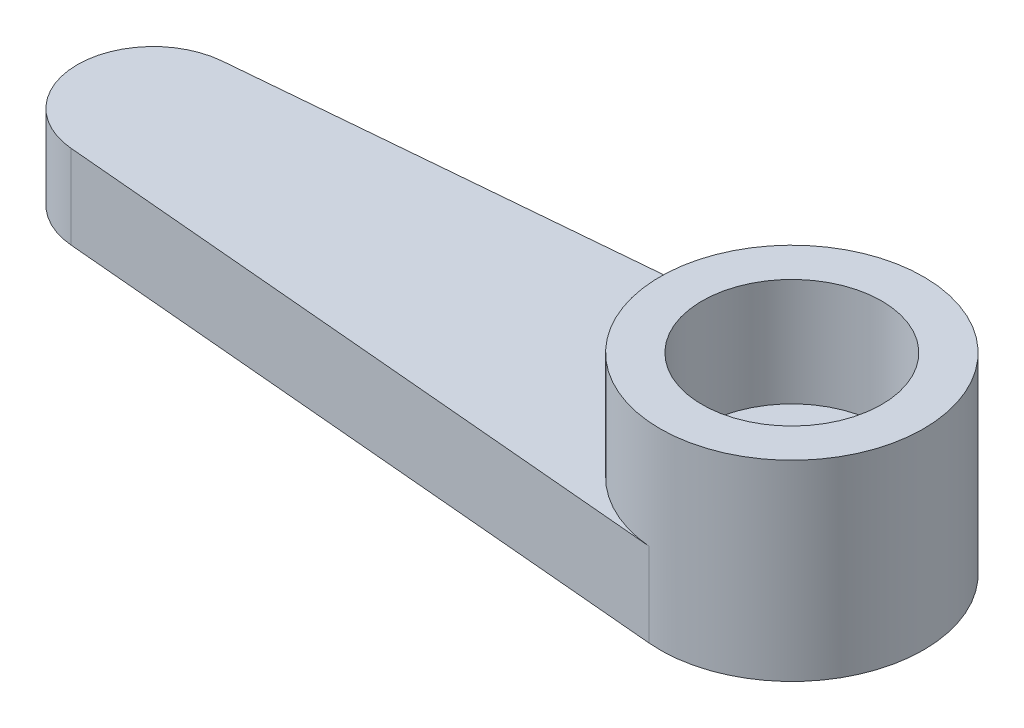
ISO-10303-21;
HEADER;
FILE_DESCRIPTION(('STEP AP214'),'2;1');
FILE_NAME('part.step','',(''),(''),'','','');
FILE_SCHEMA(('AUTOMOTIVE_DESIGN { 1 0 10303 214 1 1 1 1 }'));
ENDSEC;
DATA;
#1=APPLICATION_CONTEXT('core data for automotive mechanical design processes');
#2=APPLICATION_PROTOCOL_DEFINITION('international standard','automotive_design',2000,#1);
#3=PRODUCT_CONTEXT('',#1,'mechanical');
#4=PRODUCT('Part','Part','',(#3));
#5=PRODUCT_RELATED_PRODUCT_CATEGORY('part','',(#4));
#6=PRODUCT_DEFINITION_FORMATION('','',#4);
#7=PRODUCT_DEFINITION_CONTEXT('part definition',#1,'design');
#8=PRODUCT_DEFINITION('design','',#6,#7);
#9=PRODUCT_DEFINITION_SHAPE('','',#8);
#10=(LENGTH_UNIT() NAMED_UNIT(*) SI_UNIT(.MILLI.,.METRE.));
#11=(NAMED_UNIT(*) PLANE_ANGLE_UNIT() SI_UNIT($,.RADIAN.));
#12=(NAMED_UNIT(*) SI_UNIT($,.STERADIAN.) SOLID_ANGLE_UNIT());
#13=UNCERTAINTY_MEASURE_WITH_UNIT(LENGTH_MEASURE(1.E-05),#10,'distance_accuracy_value','');
#14=(GEOMETRIC_REPRESENTATION_CONTEXT(3) GLOBAL_UNCERTAINTY_ASSIGNED_CONTEXT((#13)) GLOBAL_UNIT_ASSIGNED_CONTEXT((#10,
#11,#12)) REPRESENTATION_CONTEXT('',''));
#15=CARTESIAN_POINT('',(0.,0.,0.));
#16=DIRECTION('',(0.,0.,1.));
#17=DIRECTION('',(1.,0.,0.));
#18=AXIS2_PLACEMENT_3D('',#15,#16,#17);
#19=CARTESIAN_POINT('',(-16.,2.1,0.));
#20=DIRECTION('',(0.,-1.,0.));
#21=DIRECTION('',(0.,0.,-1.));
#22=AXIS2_PLACEMENT_3D('',#19,#20,#21);
#23=CYLINDRICAL_SURFACE('',#22,1.9);
#24=CARTESIAN_POINT('',(-16.,0.,0.));
#25=DIRECTION('',(0.,1.,0.));
#26=DIRECTION('',(0.,0.,1.));
#27=AXIS2_PLACEMENT_3D('',#24,#25,#26);
#28=CIRCLE('',#27,1.9);
#29=CARTESIAN_POINT('',(-16.16625,0.,-1.89271258713519));
#30=VERTEX_POINT('',#29);
#31=CARTESIAN_POINT('',(-16.16625,0.,1.8927125871352));
#32=VERTEX_POINT('',#31);
#33=EDGE_CURVE('E97',#30,#32,#28,.T.);
#34=ORIENTED_EDGE('',*,*,#33,.T.);
#35=DIRECTION('',(0.,-1.,0.));
#36=VECTOR('',#35,1.);
#37=CARTESIAN_POINT('',(-16.16625,2.1,1.8927125871352));
#38=LINE('',#37,#36);
#39=CARTESIAN_POINT('',(-16.16625,2.1,1.8927125871352));
#40=VERTEX_POINT('',#39);
#41=EDGE_CURVE('E11',#40,#32,#38,.T.);
#42=ORIENTED_EDGE('',*,*,#41,.F.);
#43=CARTESIAN_POINT('',(-16.,2.1,0.));
#44=DIRECTION('',(0.,1.,0.));
#45=DIRECTION('',(0.,0.,1.));
#46=AXIS2_PLACEMENT_3D('',#43,#44,#45);
#47=CIRCLE('',#46,1.9);
#48=CARTESIAN_POINT('',(-16.16625,2.1,-1.89271258713519));
#49=VERTEX_POINT('',#48);
#50=EDGE_CURVE('E104',#49,#40,#47,.T.);
#51=ORIENTED_EDGE('',*,*,#50,.F.);
#52=DIRECTION('',(0.,-1.,0.));
#53=VECTOR('',#52,1.);
#54=CARTESIAN_POINT('',(-16.16625,2.1,-1.89271258713519));
#55=LINE('',#54,#53);
#56=EDGE_CURVE('E84',#49,#30,#55,.T.);
#57=ORIENTED_EDGE('',*,*,#56,.T.);
#58=EDGE_LOOP('',(#34,#42,#51,#57));
#59=FACE_BOUND('',#58,.T.);
#60=ADVANCED_FACE('F34',(#59),#23,.T.);
#61=CARTESIAN_POINT('',(-16.16625,2.1,1.8927125871352));
#62=DIRECTION('',(0.0874999999999998,0.,-0.996164519544839));
#63=DIRECTION('',(-0.996164519544839,0.,-0.0874999999999998));
#64=AXIS2_PLACEMENT_3D('',#61,#62,#63);
#65=PLANE('',#64);
#66=DIRECTION('',(0.996164519544839,0.,0.0874999999999998));
#67=VECTOR('',#66,1.);
#68=CARTESIAN_POINT('',(-16.16625,0.,1.8927125871352));
#69=LINE('',#68,#67);
#70=CARTESIAN_POINT('',(-0.288750000000002,0.,3.28734291449797));
#71=VERTEX_POINT('',#70);
#72=EDGE_CURVE('E109',#32,#71,#69,.T.);
#73=ORIENTED_EDGE('',*,*,#72,.T.);
#74=DIRECTION('',(0.,-1.,0.));
#75=VECTOR('',#74,1.);
#76=CARTESIAN_POINT('',(-0.288750000000002,2.1,3.28734291449797));
#77=LINE('',#76,#75);
#78=CARTESIAN_POINT('',(-0.288750000000002,2.1,3.28734291449797));
#79=VERTEX_POINT('',#78);
#80=EDGE_CURVE('E43',#79,#71,#77,.T.);
#81=ORIENTED_EDGE('',*,*,#80,.F.);
#82=DIRECTION('',(0.996164519544839,0.,0.0874999999999998));
#83=VECTOR('',#82,1.);
#84=CARTESIAN_POINT('',(-16.16625,2.1,1.8927125871352));
#85=LINE('',#84,#83);
#86=EDGE_CURVE('E80',#40,#79,#85,.T.);
#87=ORIENTED_EDGE('',*,*,#86,.F.);
#88=ORIENTED_EDGE('',*,*,#41,.T.);
#89=EDGE_LOOP('',(#73,#81,#87,#88));
#90=FACE_BOUND('',#89,.T.);
#91=ADVANCED_FACE('F119',(#90),#65,.F.);
#92=CARTESIAN_POINT('',(0.,2.1,0.));
#93=DIRECTION('',(0.,-1.,0.));
#94=DIRECTION('',(0.,0.,-1.));
#95=AXIS2_PLACEMENT_3D('',#92,#93,#94);
#96=CYLINDRICAL_SURFACE('',#95,3.3);
#97=CARTESIAN_POINT('',(0.,0.,0.));
#98=DIRECTION('',(0.,1.,0.));
#99=DIRECTION('',(0.,0.,1.));
#100=AXIS2_PLACEMENT_3D('',#97,#98,#99);
#101=CIRCLE('',#100,3.3);
#102=CARTESIAN_POINT('',(-0.288750000000001,0.,-3.28734291449797));
#103=VERTEX_POINT('',#102);
#104=EDGE_CURVE('E70',#71,#103,#101,.T.);
#105=ORIENTED_EDGE('',*,*,#104,.T.);
#106=DIRECTION('',(0.,-1.,0.));
#107=VECTOR('',#106,1.);
#108=CARTESIAN_POINT('',(-0.288750000000001,2.1,-3.28734291449797));
#109=LINE('',#108,#107);
#110=CARTESIAN_POINT('',(-0.288750000000001,2.1,-3.28734291449797));
#111=VERTEX_POINT('',#110);
#112=EDGE_CURVE('E83',#111,#103,#109,.T.);
#113=ORIENTED_EDGE('',*,*,#112,.F.);
#114=CARTESIAN_POINT('',(0.,2.1,0.));
#115=DIRECTION('',(0.,1.,0.));
#116=DIRECTION('',(0.,0.,1.));
#117=AXIS2_PLACEMENT_3D('',#114,#115,#116);
#118=CIRCLE('',#117,3.3);
#119=EDGE_CURVE('E90',#111,#79,#118,.T.);
#120=ORIENTED_EDGE('',*,*,#119,.T.);
#121=ORIENTED_EDGE('',*,*,#80,.T.);
#122=EDGE_LOOP('',(#105,#113,#120,#121));
#123=FACE_BOUND('',#122,.T.);
#124=CARTESIAN_POINT('',(0.,4.8,0.));
#125=DIRECTION('',(0.,1.,0.));
#126=DIRECTION('',(0.,0.,1.));
#127=AXIS2_PLACEMENT_3D('',#124,#125,#126);
#128=CIRCLE('',#127,3.3);
#129=CARTESIAN_POINT('',(0.,4.8,3.3));
#130=VERTEX_POINT('',#129);
#131=EDGE_CURVE('E93',#130,#130,#128,.T.);
#132=ORIENTED_EDGE('',*,*,#131,.F.);
#133=EDGE_LOOP('',(#132));
#134=FACE_BOUND('',#133,.T.);
#135=ADVANCED_FACE('F88',(#123,#134),#96,.T.);
#136=CARTESIAN_POINT('',(-16.16625,2.1,-1.89271258713519));
#137=DIRECTION('',(0.0875000000000001,0.,0.996164519544839));
#138=DIRECTION('',(0.996164519544839,0.,-0.0875000000000001));
#139=AXIS2_PLACEMENT_3D('',#136,#137,#138);
#140=PLANE('',#139);
#141=DIRECTION('',(-0.996164519544839,0.,0.0875000000000001));
#142=VECTOR('',#141,1.);
#143=CARTESIAN_POINT('',(-16.16625,0.,-1.89271258713519));
#144=LINE('',#143,#142);
#145=EDGE_CURVE('E75',#103,#30,#144,.T.);
#146=ORIENTED_EDGE('',*,*,#145,.T.);
#147=ORIENTED_EDGE('',*,*,#56,.F.);
#148=DIRECTION('',(-0.996164519544839,0.,0.0875000000000001));
#149=VECTOR('',#148,1.);
#150=CARTESIAN_POINT('',(-16.16625,2.1,-1.89271258713519));
#151=LINE('',#150,#149);
#152=EDGE_CURVE('E51',#111,#49,#151,.T.);
#153=ORIENTED_EDGE('',*,*,#152,.F.);
#154=ORIENTED_EDGE('',*,*,#112,.T.);
#155=EDGE_LOOP('',(#146,#147,#153,#154));
#156=FACE_BOUND('',#155,.T.);
#157=ADVANCED_FACE('F82',(#156),#140,.F.);
#158=CARTESIAN_POINT('',(-16.,2.1,0.));
#159=DIRECTION('',(0.,1.,0.));
#160=DIRECTION('',(0.,0.,1.));
#161=AXIS2_PLACEMENT_3D('',#158,#159,#160);
#162=PLANE('',#161);
#163=ORIENTED_EDGE('',*,*,#119,.F.);
#164=ORIENTED_EDGE('',*,*,#152,.T.);
#165=ORIENTED_EDGE('',*,*,#50,.T.);
#166=ORIENTED_EDGE('',*,*,#86,.T.);
#167=EDGE_LOOP('',(#163,#164,#165,#166));
#168=FACE_BOUND('',#167,.T.);
#169=ADVANCED_FACE('F92',(#168),#162,.T.);
#170=CARTESIAN_POINT('',(-16.,0.,0.));
#171=DIRECTION('',(0.,1.,0.));
#172=DIRECTION('',(0.,0.,1.));
#173=AXIS2_PLACEMENT_3D('',#170,#171,#172);
#174=PLANE('',#173);
#175=CARTESIAN_POINT('',(0.,0.,0.));
#176=DIRECTION('',(0.,1.,0.));
#177=DIRECTION('',(0.,0.,1.));
#178=AXIS2_PLACEMENT_3D('',#175,#176,#177);
#179=CIRCLE('',#178,1.2);
#180=CARTESIAN_POINT('',(0.,0.,1.2));
#181=VERTEX_POINT('',#180);
#182=EDGE_CURVE('E37',#181,#181,#179,.T.);
#183=ORIENTED_EDGE('',*,*,#182,.T.);
#184=EDGE_LOOP('',(#183));
#185=FACE_BOUND('',#184,.T.);
#186=ORIENTED_EDGE('',*,*,#33,.F.);
#187=ORIENTED_EDGE('',*,*,#145,.F.);
#188=ORIENTED_EDGE('',*,*,#104,.F.);
#189=ORIENTED_EDGE('',*,*,#72,.F.);
#190=EDGE_LOOP('',(#186,#187,#188,#189));
#191=FACE_BOUND('',#190,.T.);
#192=ADVANCED_FACE('F116',(#185,#191),#174,.F.);
#193=CARTESIAN_POINT('',(0.,4.8,0.));
#194=DIRECTION('',(0.,1.,0.));
#195=DIRECTION('',(0.,0.,1.));
#196=AXIS2_PLACEMENT_3D('',#193,#194,#195);
#197=PLANE('',#196);
#198=ORIENTED_EDGE('',*,*,#131,.T.);
#199=EDGE_LOOP('',(#198));
#200=FACE_BOUND('',#199,.T.);
#201=CARTESIAN_POINT('',(0.,4.8,0.));
#202=DIRECTION('',(0.,1.,0.));
#203=DIRECTION('',(0.,0.,1.));
#204=AXIS2_PLACEMENT_3D('',#201,#202,#203);
#205=CIRCLE('',#204,2.25);
#206=CARTESIAN_POINT('',(0.,4.8,-2.25));
#207=VERTEX_POINT('',#206);
#208=EDGE_CURVE('E94',#207,#207,#205,.T.);
#209=ORIENTED_EDGE('',*,*,#208,.F.);
#210=EDGE_LOOP('',(#209));
#211=FACE_BOUND('',#210,.T.);
#212=ADVANCED_FACE('F131',(#200,#211),#197,.T.);
#213=CARTESIAN_POINT('',(0.,4.8,0.));
#214=DIRECTION('',(0.,-1.,0.));
#215=DIRECTION('',(0.,0.,-1.));
#216=AXIS2_PLACEMENT_3D('',#213,#214,#215);
#217=CYLINDRICAL_SURFACE('',#216,2.25);
#218=CARTESIAN_POINT('',(0.,2.1,0.));
#219=DIRECTION('',(0.,1.,0.));
#220=DIRECTION('',(0.,0.,1.));
#221=AXIS2_PLACEMENT_3D('',#218,#219,#220);
#222=CIRCLE('',#221,2.25);
#223=CARTESIAN_POINT('',(0.,2.1,-2.25));
#224=VERTEX_POINT('',#223);
#225=EDGE_CURVE('E100',#224,#224,#222,.T.);
#226=CARTESIAN_POINT('',(0.,4.8,-2.25));
#227=CARTESIAN_POINT('',(0.,4.771875,-2.25));
#228=CARTESIAN_POINT('',(0.,4.74375,-2.25));
#229=CARTESIAN_POINT('',(0.,4.6875,-2.25));
#230=CARTESIAN_POINT('',(0.,4.659375,-2.25));
#231=CARTESIAN_POINT('',(0.,4.603125,-2.25));
#232=CARTESIAN_POINT('',(0.,4.575,-2.25));
#233=CARTESIAN_POINT('',(0.,4.51875,-2.25));
#234=CARTESIAN_POINT('',(0.,4.490625,-2.25));
#235=CARTESIAN_POINT('',(0.,4.434375,-2.25));
#236=CARTESIAN_POINT('',(0.,4.40625,-2.25));
#237=CARTESIAN_POINT('',(0.,4.35,-2.25));
#238=CARTESIAN_POINT('',(0.,4.321875,-2.25));
#239=CARTESIAN_POINT('',(0.,4.265625,-2.25));
#240=CARTESIAN_POINT('',(0.,4.2375,-2.25));
#241=CARTESIAN_POINT('',(0.,4.18125,-2.25));
#242=CARTESIAN_POINT('',(0.,4.153125,-2.25));
#243=CARTESIAN_POINT('',(0.,4.096875,-2.25));
#244=CARTESIAN_POINT('',(0.,4.06875,-2.25));
#245=CARTESIAN_POINT('',(0.,4.0125,-2.25));
#246=CARTESIAN_POINT('',(0.,3.984375,-2.25));
#247=CARTESIAN_POINT('',(0.,3.928125,-2.25));
#248=CARTESIAN_POINT('',(0.,3.9,-2.25));
#249=CARTESIAN_POINT('',(0.,3.84375,-2.25));
#250=CARTESIAN_POINT('',(0.,3.815625,-2.25));
#251=CARTESIAN_POINT('',(0.,3.759375,-2.25));
#252=CARTESIAN_POINT('',(0.,3.73125,-2.25));
#253=CARTESIAN_POINT('',(0.,3.675,-2.25));
#254=CARTESIAN_POINT('',(0.,3.646875,-2.25));
#255=CARTESIAN_POINT('',(0.,3.590625,-2.25));
#256=CARTESIAN_POINT('',(0.,3.5625,-2.25));
#257=CARTESIAN_POINT('',(0.,3.50625,-2.25));
#258=CARTESIAN_POINT('',(0.,3.478125,-2.25));
#259=CARTESIAN_POINT('',(0.,3.421875,-2.25));
#260=CARTESIAN_POINT('',(0.,3.39375,-2.25));
#261=CARTESIAN_POINT('',(0.,3.3375,-2.25));
#262=CARTESIAN_POINT('',(0.,3.309375,-2.25));
#263=CARTESIAN_POINT('',(0.,3.253125,-2.25));
#264=CARTESIAN_POINT('',(0.,3.225,-2.25));
#265=CARTESIAN_POINT('',(0.,3.16875,-2.25));
#266=CARTESIAN_POINT('',(0.,3.140625,-2.25));
#267=CARTESIAN_POINT('',(0.,3.084375,-2.25));
#268=CARTESIAN_POINT('',(0.,3.05625,-2.25));
#269=CARTESIAN_POINT('',(0.,3.,-2.25));
#270=CARTESIAN_POINT('',(0.,2.971875,-2.25));
#271=CARTESIAN_POINT('',(0.,2.915625,-2.25));
#272=CARTESIAN_POINT('',(0.,2.8875,-2.25));
#273=CARTESIAN_POINT('',(0.,2.83125,-2.25));
#274=CARTESIAN_POINT('',(0.,2.803125,-2.25));
#275=CARTESIAN_POINT('',(0.,2.746875,-2.25));
#276=CARTESIAN_POINT('',(0.,2.71875,-2.25));
#277=CARTESIAN_POINT('',(0.,2.6625,-2.25));
#278=CARTESIAN_POINT('',(0.,2.634375,-2.25));
#279=CARTESIAN_POINT('',(0.,2.578125,-2.25));
#280=CARTESIAN_POINT('',(0.,2.55,-2.25));
#281=CARTESIAN_POINT('',(0.,2.49375,-2.25));
#282=CARTESIAN_POINT('',(0.,2.465625,-2.25));
#283=CARTESIAN_POINT('',(0.,2.409375,-2.25));
#284=CARTESIAN_POINT('',(0.,2.38125,-2.25));
#285=CARTESIAN_POINT('',(0.,2.325,-2.25));
#286=CARTESIAN_POINT('',(0.,2.296875,-2.25));
#287=CARTESIAN_POINT('',(0.,2.240625,-2.25));
#288=CARTESIAN_POINT('',(0.,2.2125,-2.25));
#289=CARTESIAN_POINT('',(0.,2.15625,-2.25));
#290=CARTESIAN_POINT('',(0.,2.128125,-2.25));
#291=CARTESIAN_POINT('',(0.,2.1,-2.25));
#292=B_SPLINE_CURVE_WITH_KNOTS('',3,(#226,#227,#228,#229,#230,#231,#232,#233,#234,#235,#236,
#237,#238,#239,#240,#241,#242,#243,#244,#245,#246,#247,#248,#249,#250,#251,#252,#253,#254,#255,
#256,#257,#258,#259,#260,#261,#262,#263,#264,#265,#266,#267,#268,#269,#270,#271,#272,#273,#274,
#275,#276,#277,#278,#279,#280,#281,#282,#283,#284,#285,#286,#287,#288,#289,#290,#291),
.UNSPECIFIED.,.F.,.F.,(4,2,2,2,2,2,2,2,2,2,2,2,2,2,2,2,2,2,2,2,2,2,2,2,2,2,2,2,2,2,2,2,4),(0.,
0.0843749999999994,0.16875,0.253125,0.337499999999999,0.421875,0.50625,0.590625,
0.674999999999999,0.759375,0.84375,0.928125,1.0125,1.096875,1.18125,1.265625,1.35,1.434375,
1.51875,1.603125,1.6875,1.771875,1.85625,1.940625,2.025,2.109375,2.19375,2.278125,2.3625,
2.446875,2.53125,2.615625,2.7),.UNSPECIFIED.);
#293=EDGE_CURVE('BSEAM138',#207,#224,#292,.T.);
#294=ORIENTED_EDGE('',*,*,#208,.T.);
#295=ORIENTED_EDGE('',*,*,#225,.F.);
#296=ORIENTED_EDGE('',*,*,#293,.T.);
#297=ORIENTED_EDGE('',*,*,#293,.F.);
#298=EDGE_LOOP('',(#294,#296,#295,#297));
#299=FACE_BOUND('',#298,.T.);
#300=ADVANCED_FACE('F138',(#299),#217,.F.);
#301=CARTESIAN_POINT('',(0.,2.1,0.));
#302=DIRECTION('',(0.,1.,0.));
#303=DIRECTION('',(0.,0.,1.));
#304=AXIS2_PLACEMENT_3D('',#301,#302,#303);
#305=CIRCLE('',#304,1.2);
#306=CARTESIAN_POINT('',(0.,2.1,1.2));
#307=VERTEX_POINT('',#306);
#308=EDGE_CURVE('E153',#307,#307,#305,.T.);
#309=ORIENTED_EDGE('',*,*,#308,.F.);
#310=EDGE_LOOP('',(#309));
#311=FACE_BOUND('',#310,.T.);
#312=ORIENTED_EDGE('',*,*,#225,.T.);
#313=EDGE_LOOP('',(#312));
#314=FACE_BOUND('',#313,.T.);
#315=ADVANCED_FACE('F135',(#311,#314),#162,.T.);
#316=CARTESIAN_POINT('',(0.,-0.6,0.));
#317=DIRECTION('',(0.,1.,0.));
#318=DIRECTION('',(0.,0.,1.));
#319=AXIS2_PLACEMENT_3D('',#316,#317,#318);
#320=CYLINDRICAL_SURFACE('',#319,1.2);
#321=CARTESIAN_POINT('',(0.,2.1,1.2));
#322=CARTESIAN_POINT('',(0.,2.078125,1.2));
#323=CARTESIAN_POINT('',(0.,2.05625,1.2));
#324=CARTESIAN_POINT('',(0.,2.0125,1.2));
#325=CARTESIAN_POINT('',(0.,1.990625,1.2));
#326=CARTESIAN_POINT('',(0.,1.946875,1.2));
#327=CARTESIAN_POINT('',(0.,1.925,1.2));
#328=CARTESIAN_POINT('',(0.,1.88125,1.2));
#329=CARTESIAN_POINT('',(0.,1.859375,1.2));
#330=CARTESIAN_POINT('',(0.,1.815625,1.2));
#331=CARTESIAN_POINT('',(0.,1.79375,1.2));
#332=CARTESIAN_POINT('',(0.,1.75,1.2));
#333=CARTESIAN_POINT('',(0.,1.728125,1.2));
#334=CARTESIAN_POINT('',(0.,1.684375,1.2));
#335=CARTESIAN_POINT('',(0.,1.6625,1.2));
#336=CARTESIAN_POINT('',(0.,1.61875,1.2));
#337=CARTESIAN_POINT('',(0.,1.596875,1.2));
#338=CARTESIAN_POINT('',(0.,1.553125,1.2));
#339=CARTESIAN_POINT('',(0.,1.53125,1.2));
#340=CARTESIAN_POINT('',(0.,1.4875,1.2));
#341=CARTESIAN_POINT('',(0.,1.465625,1.2));
#342=CARTESIAN_POINT('',(0.,1.421875,1.2));
#343=CARTESIAN_POINT('',(0.,1.4,1.2));
#344=CARTESIAN_POINT('',(0.,1.35625,1.2));
#345=CARTESIAN_POINT('',(0.,1.334375,1.2));
#346=CARTESIAN_POINT('',(0.,1.290625,1.2));
#347=CARTESIAN_POINT('',(0.,1.26875,1.2));
#348=CARTESIAN_POINT('',(0.,1.225,1.2));
#349=CARTESIAN_POINT('',(0.,1.203125,1.2));
#350=CARTESIAN_POINT('',(0.,1.159375,1.2));
#351=CARTESIAN_POINT('',(0.,1.1375,1.2));
#352=CARTESIAN_POINT('',(0.,1.09375,1.2));
#353=CARTESIAN_POINT('',(0.,1.071875,1.2));
#354=CARTESIAN_POINT('',(0.,1.028125,1.2));
#355=CARTESIAN_POINT('',(0.,1.00625,1.2));
#356=CARTESIAN_POINT('',(0.,0.9625,1.2));
#357=CARTESIAN_POINT('',(0.,0.940625,1.2));
#358=CARTESIAN_POINT('',(0.,0.896875,1.2));
#359=CARTESIAN_POINT('',(0.,0.875,1.2));
#360=CARTESIAN_POINT('',(0.,0.83125,1.2));
#361=CARTESIAN_POINT('',(0.,0.809375,1.2));
#362=CARTESIAN_POINT('',(0.,0.765625,1.2));
#363=CARTESIAN_POINT('',(0.,0.74375,1.2));
#364=CARTESIAN_POINT('',(0.,0.7,1.2));
#365=CARTESIAN_POINT('',(0.,0.678125,1.2));
#366=CARTESIAN_POINT('',(0.,0.634375,1.2));
#367=CARTESIAN_POINT('',(0.,0.6125,1.2));
#368=CARTESIAN_POINT('',(0.,0.56875,1.2));
#369=CARTESIAN_POINT('',(0.,0.546875,1.2));
#370=CARTESIAN_POINT('',(0.,0.503125,1.2));
#371=CARTESIAN_POINT('',(0.,0.48125,1.2));
#372=CARTESIAN_POINT('',(0.,0.4375,1.2));
#373=CARTESIAN_POINT('',(0.,0.415625,1.2));
#374=CARTESIAN_POINT('',(0.,0.371875,1.2));
#375=CARTESIAN_POINT('',(0.,0.35,1.2));
#376=CARTESIAN_POINT('',(0.,0.30625,1.2));
#377=CARTESIAN_POINT('',(0.,0.284375,1.2));
#378=CARTESIAN_POINT('',(0.,0.240625,1.2));
#379=CARTESIAN_POINT('',(0.,0.21875,1.2));
#380=CARTESIAN_POINT('',(0.,0.175,1.2));
#381=CARTESIAN_POINT('',(0.,0.153125,1.2));
#382=CARTESIAN_POINT('',(0.,0.109375,1.2));
#383=CARTESIAN_POINT('',(0.,0.0874999999999999,1.2));
#384=CARTESIAN_POINT('',(0.,0.04375,1.2));
#385=CARTESIAN_POINT('',(0.,0.0218749999999999,1.2));
#386=CARTESIAN_POINT('',(0.,0.,1.2));
#387=B_SPLINE_CURVE_WITH_KNOTS('',3,(#321,#322,#323,#324,#325,#326,#327,#328,#329,#330,#331,
#332,#333,#334,#335,#336,#337,#338,#339,#340,#341,#342,#343,#344,#345,#346,#347,#348,#349,#350,
#351,#352,#353,#354,#355,#356,#357,#358,#359,#360,#361,#362,#363,#364,#365,#366,#367,#368,#369,
#370,#371,#372,#373,#374,#375,#376,#377,#378,#379,#380,#381,#382,#383,#384,#385,#386),
.UNSPECIFIED.,.F.,.F.,(4,2,2,2,2,2,2,2,2,2,2,2,2,2,2,2,2,2,2,2,2,2,2,2,2,2,2,2,2,2,2,2,4),(0.,
0.0656250000000001,0.13125,0.196875,0.2625,0.328125,0.39375,0.459375,0.525,0.590625,0.65625,
0.721875,0.7875,0.853125,0.91875,0.984375,1.05,1.115625,1.18125,1.246875,1.3125,1.378125,
1.44375,1.509375,1.575,1.640625,1.70625,1.771875,1.8375,1.903125,1.96875,2.034375,2.1),.UNSPECIFIED.);
#388=EDGE_CURVE('BSEAM143',#307,#181,#387,.T.);
#389=ORIENTED_EDGE('',*,*,#308,.T.);
#390=ORIENTED_EDGE('',*,*,#182,.F.);
#391=ORIENTED_EDGE('',*,*,#388,.T.);
#392=ORIENTED_EDGE('',*,*,#388,.F.);
#393=EDGE_LOOP('',(#389,#391,#390,#392));
#394=FACE_BOUND('',#393,.T.);
#395=ADVANCED_FACE('F143',(#394),#320,.F.);
#396=CLOSED_SHELL('',(#60,#91,#135,#157,#169,#192,#212,#300,#315,#395));
#397=MANIFOLD_SOLID_BREP('B2',#396);
#398=ADVANCED_BREP_SHAPE_REPRESENTATION('',(#18,#397),#14);
#399=SHAPE_DEFINITION_REPRESENTATION(#9,#398);
ENDSEC;
END-ISO-10303-21;
